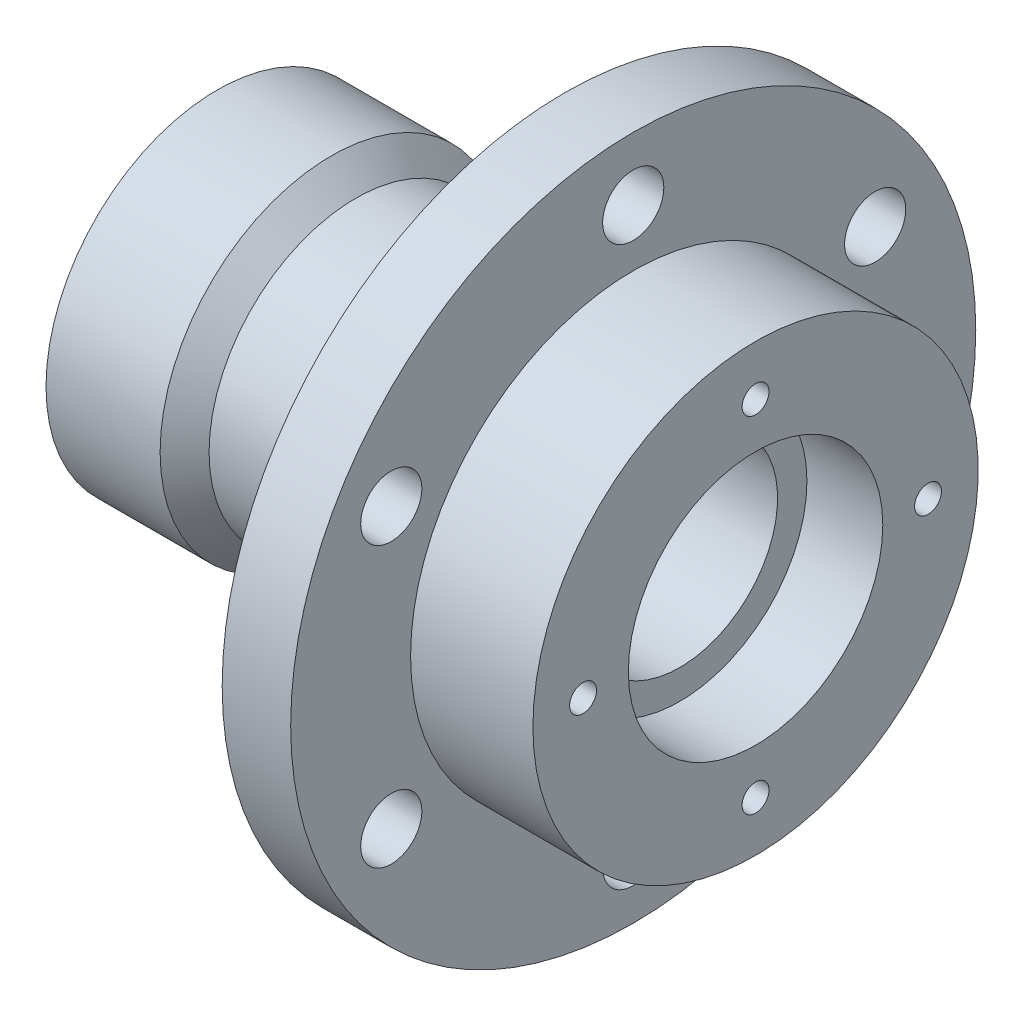
ISO-10303-21;
HEADER;
FILE_DESCRIPTION(('STEP AP214'),'2;1');
FILE_NAME('part.step','',(''),(''),'','','');
FILE_SCHEMA(('AUTOMOTIVE_DESIGN { 1 0 10303 214 1 1 1 1 }'));
ENDSEC;
DATA;
#1=APPLICATION_CONTEXT('core data for automotive mechanical design processes');
#2=APPLICATION_PROTOCOL_DEFINITION('international standard','automotive_design',2000,#1);
#3=PRODUCT_CONTEXT('',#1,'mechanical');
#4=PRODUCT('Part','Part','',(#3));
#5=PRODUCT_RELATED_PRODUCT_CATEGORY('part','',(#4));
#6=PRODUCT_DEFINITION_FORMATION('','',#4);
#7=PRODUCT_DEFINITION_CONTEXT('part definition',#1,'design');
#8=PRODUCT_DEFINITION('design','',#6,#7);
#9=PRODUCT_DEFINITION_SHAPE('','',#8);
#10=(LENGTH_UNIT() NAMED_UNIT(*) SI_UNIT(.MILLI.,.METRE.));
#11=(NAMED_UNIT(*) PLANE_ANGLE_UNIT() SI_UNIT($,.RADIAN.));
#12=(NAMED_UNIT(*) SI_UNIT($,.STERADIAN.) SOLID_ANGLE_UNIT());
#13=UNCERTAINTY_MEASURE_WITH_UNIT(LENGTH_MEASURE(1.E-05),#10,'distance_accuracy_value','');
#14=(GEOMETRIC_REPRESENTATION_CONTEXT(3) GLOBAL_UNCERTAINTY_ASSIGNED_CONTEXT((#13)) GLOBAL_UNIT_ASSIGNED_CONTEXT((#10,
#11,#12)) REPRESENTATION_CONTEXT('',''));
#15=CARTESIAN_POINT('',(0.,0.,0.));
#16=DIRECTION('',(0.,0.,1.));
#17=DIRECTION('',(1.,0.,0.));
#18=AXIS2_PLACEMENT_3D('',#15,#16,#17);
#19=CARTESIAN_POINT('',(85.,0.,0.));
#20=DIRECTION('',(1.,0.,0.));
#21=DIRECTION('',(0.,0.,-1.));
#22=AXIS2_PLACEMENT_3D('',#19,#20,#21);
#23=PLANE('',#22);
#24=CARTESIAN_POINT('',(85.,28.5450000000006,49.4413903020533));
#25=DIRECTION('',(1.,0.,0.));
#26=DIRECTION('',(0.,0.,-1.));
#27=AXIS2_PLACEMENT_3D('',#24,#25,#26);
#28=CIRCLE('',#27,6.24999999999999);
#29=CARTESIAN_POINT('',(85.,28.5450000000006,43.1913903020533));
#30=VERTEX_POINT('',#29);
#31=EDGE_CURVE('E95',#30,#30,#28,.F.);
#32=ORIENTED_EDGE('',*,*,#31,.T.);
#33=EDGE_LOOP('',(#32));
#34=FACE_BOUND('',#33,.T.);
#35=CARTESIAN_POINT('',(85.,-28.5449999999995,49.4413903020539));
#36=DIRECTION('',(1.,0.,0.));
#37=DIRECTION('',(0.,0.,-1.));
#38=AXIS2_PLACEMENT_3D('',#35,#36,#37);
#39=CIRCLE('',#38,6.24999999999999);
#40=CARTESIAN_POINT('',(85.,-28.5449999999995,43.1913903020539));
#41=VERTEX_POINT('',#40);
#42=EDGE_CURVE('E101',#41,#41,#39,.F.);
#43=ORIENTED_EDGE('',*,*,#42,.T.);
#44=EDGE_LOOP('',(#43));
#45=FACE_BOUND('',#44,.T.);
#46=CARTESIAN_POINT('',(85.,-28.5450000000002,-49.4413903020535));
#47=DIRECTION('',(1.,0.,0.));
#48=DIRECTION('',(0.,0.,-1.));
#49=AXIS2_PLACEMENT_3D('',#46,#47,#48);
#50=CIRCLE('',#49,6.24999999999999);
#51=CARTESIAN_POINT('',(85.,-28.5450000000002,-55.6913903020535));
#52=VERTEX_POINT('',#51);
#53=EDGE_CURVE('E113',#52,#52,#50,.F.);
#54=ORIENTED_EDGE('',*,*,#53,.T.);
#55=EDGE_LOOP('',(#54));
#56=FACE_BOUND('',#55,.T.);
#57=CARTESIAN_POINT('',(85.,28.5449999999999,-49.4413903020537));
#58=DIRECTION('',(1.,0.,0.));
#59=DIRECTION('',(0.,0.,-1.));
#60=AXIS2_PLACEMENT_3D('',#57,#58,#59);
#61=CIRCLE('',#60,6.24999999999999);
#62=CARTESIAN_POINT('',(85.,28.5449999999999,-55.6913903020537));
#63=VERTEX_POINT('',#62);
#64=EDGE_CURVE('E119',#63,#63,#61,.F.);
#65=ORIENTED_EDGE('',*,*,#64,.T.);
#66=EDGE_LOOP('',(#65));
#67=FACE_BOUND('',#66,.T.);
#68=CARTESIAN_POINT('',(85.,0.,0.));
#69=DIRECTION('',(-1.,0.,0.));
#70=DIRECTION('',(0.,0.,1.));
#71=AXIS2_PLACEMENT_3D('',#68,#69,#70);
#72=CIRCLE('',#71,70.);
#73=CARTESIAN_POINT('',(85.,0.,70.));
#74=VERTEX_POINT('',#73);
#75=EDGE_CURVE('E167',#74,#74,#72,.T.);
#76=ORIENTED_EDGE('',*,*,#75,.F.);
#77=EDGE_LOOP('',(#76));
#78=FACE_BOUND('',#77,.T.);
#79=CARTESIAN_POINT('',(85.,0.,0.));
#80=DIRECTION('',(-1.,0.,0.));
#81=DIRECTION('',(0.,0.,1.));
#82=AXIS2_PLACEMENT_3D('',#79,#80,#81);
#83=CIRCLE('',#82,45.5);
#84=CARTESIAN_POINT('',(85.,0.,45.5));
#85=VERTEX_POINT('',#84);
#86=EDGE_CURVE('E170',#85,#85,#83,.T.);
#87=ORIENTED_EDGE('',*,*,#86,.T.);
#88=EDGE_LOOP('',(#87));
#89=FACE_BOUND('',#88,.T.);
#90=CARTESIAN_POINT('',(85.,57.09,0.));
#91=DIRECTION('',(1.,0.,0.));
#92=DIRECTION('',(0.,0.,-1.));
#93=AXIS2_PLACEMENT_3D('',#90,#91,#92);
#94=CIRCLE('',#93,6.24999999999999);
#95=CARTESIAN_POINT('',(85.,57.09,-6.24999999999999));
#96=VERTEX_POINT('',#95);
#97=EDGE_CURVE('E125',#96,#96,#94,.F.);
#98=ORIENTED_EDGE('',*,*,#97,.T.);
#99=EDGE_LOOP('',(#98));
#100=FACE_BOUND('',#99,.T.);
#101=CARTESIAN_POINT('',(85.,-57.09,0.));
#102=DIRECTION('',(1.,0.,0.));
#103=DIRECTION('',(0.,0.,-1.));
#104=AXIS2_PLACEMENT_3D('',#101,#102,#103);
#105=CIRCLE('',#104,6.25);
#106=CARTESIAN_POINT('',(85.,-57.09,-6.25));
#107=VERTEX_POINT('',#106);
#108=EDGE_CURVE('E107',#107,#107,#105,.F.);
#109=ORIENTED_EDGE('',*,*,#108,.T.);
#110=EDGE_LOOP('',(#109));
#111=FACE_BOUND('',#110,.T.);
#112=ADVANCED_FACE('F38',(#34,#45,#56,#67,#78,#89,#100,#111),#23,.T.);
#113=CARTESIAN_POINT('',(94.5,0.,0.));
#114=DIRECTION('',(-1.,0.,0.));
#115=DIRECTION('',(0.,0.,1.));
#116=AXIS2_PLACEMENT_3D('',#113,#114,#115);
#117=PLANE('',#116);
#118=CARTESIAN_POINT('',(94.5,0.,0.));
#119=DIRECTION('',(-1.,0.,0.));
#120=DIRECTION('',(0.,0.,1.));
#121=AXIS2_PLACEMENT_3D('',#118,#119,#120);
#122=CIRCLE('',#121,26.);
#123=CARTESIAN_POINT('',(94.5,0.,26.));
#124=VERTEX_POINT('',#123);
#125=EDGE_CURVE('E11',#124,#124,#122,.T.);
#126=ORIENTED_EDGE('',*,*,#125,.F.);
#127=EDGE_LOOP('',(#126));
#128=FACE_BOUND('',#127,.T.);
#129=CARTESIAN_POINT('',(94.5,0.,0.));
#130=DIRECTION('',(-1.,0.,0.));
#131=DIRECTION('',(0.,0.,1.));
#132=AXIS2_PLACEMENT_3D('',#129,#130,#131);
#133=CIRCLE('',#132,20.);
#134=CARTESIAN_POINT('',(94.5,0.,20.));
#135=VERTEX_POINT('',#134);
#136=EDGE_CURVE('E128',#135,#135,#133,.T.);
#137=ORIENTED_EDGE('',*,*,#136,.T.);
#138=EDGE_LOOP('',(#137));
#139=FACE_BOUND('',#138,.T.);
#140=ADVANCED_FACE('F40',(#128,#139),#117,.F.);
#141=CARTESIAN_POINT('',(-28.7480653287739,0.,0.));
#142=DIRECTION('',(-1.,0.,0.));
#143=DIRECTION('',(0.,0.,1.));
#144=AXIS2_PLACEMENT_3D('',#141,#142,#143);
#145=CYLINDRICAL_SURFACE('',#144,26.);
#146=CARTESIAN_POINT('',(110.,0.,0.));
#147=DIRECTION('',(-1.,0.,0.));
#148=DIRECTION('',(0.,0.,1.));
#149=AXIS2_PLACEMENT_3D('',#146,#147,#148);
#150=CIRCLE('',#149,26.);
#151=CARTESIAN_POINT('',(110.,0.,26.));
#152=VERTEX_POINT('',#151);
#153=EDGE_CURVE('E46',#152,#152,#150,.T.);
#154=ORIENTED_EDGE('',*,*,#153,.F.);
#155=EDGE_LOOP('',(#154));
#156=FACE_BOUND('',#155,.T.);
#157=ORIENTED_EDGE('',*,*,#125,.T.);
#158=EDGE_LOOP('',(#157));
#159=FACE_BOUND('',#158,.T.);
#160=ADVANCED_FACE('F181',(#156,#159),#145,.F.);
#161=CARTESIAN_POINT('',(110.,0.,0.));
#162=DIRECTION('',(1.,0.,0.));
#163=DIRECTION('',(0.,0.,-1.));
#164=AXIS2_PLACEMENT_3D('',#161,#162,#163);
#165=PLANE('',#164);
#166=CARTESIAN_POINT('',(110.,3.69224151582661E-13,35.25));
#167=DIRECTION('',(1.,0.,0.));
#168=DIRECTION('',(0.,0.,-1.));
#169=AXIS2_PLACEMENT_3D('',#166,#167,#168);
#170=CIRCLE('',#169,2.75);
#171=CARTESIAN_POINT('',(110.,3.69224151582661E-13,32.5));
#172=VERTEX_POINT('',#171);
#173=EDGE_CURVE('E70',#172,#172,#170,.T.);
#174=ORIENTED_EDGE('',*,*,#173,.F.);
#175=EDGE_LOOP('',(#174));
#176=FACE_BOUND('',#175,.T.);
#177=CARTESIAN_POINT('',(110.,-35.25,0.));
#178=DIRECTION('',(1.,0.,0.));
#179=DIRECTION('',(0.,0.,-1.));
#180=AXIS2_PLACEMENT_3D('',#177,#178,#179);
#181=CIRCLE('',#180,2.75);
#182=CARTESIAN_POINT('',(110.,-35.25,-2.75));
#183=VERTEX_POINT('',#182);
#184=EDGE_CURVE('E69',#183,#183,#181,.T.);
#185=ORIENTED_EDGE('',*,*,#184,.F.);
#186=EDGE_LOOP('',(#185));
#187=FACE_BOUND('',#186,.T.);
#188=CARTESIAN_POINT('',(110.,-1.2307471719422E-13,-35.25));
#189=DIRECTION('',(1.,0.,0.));
#190=DIRECTION('',(0.,0.,-1.));
#191=AXIS2_PLACEMENT_3D('',#188,#189,#190);
#192=CIRCLE('',#191,2.75);
#193=CARTESIAN_POINT('',(110.,-1.2307471719422E-13,-38.));
#194=VERTEX_POINT('',#193);
#195=EDGE_CURVE('E80',#194,#194,#192,.T.);
#196=ORIENTED_EDGE('',*,*,#195,.F.);
#197=EDGE_LOOP('',(#196));
#198=FACE_BOUND('',#197,.T.);
#199=CARTESIAN_POINT('',(110.,35.25,0.));
#200=DIRECTION('',(1.,0.,0.));
#201=DIRECTION('',(0.,0.,-1.));
#202=AXIS2_PLACEMENT_3D('',#199,#200,#201);
#203=CIRCLE('',#202,2.75);
#204=CARTESIAN_POINT('',(110.,35.25,-2.75));
#205=VERTEX_POINT('',#204);
#206=EDGE_CURVE('E86',#205,#205,#203,.T.);
#207=ORIENTED_EDGE('',*,*,#206,.F.);
#208=EDGE_LOOP('',(#207));
#209=FACE_BOUND('',#208,.T.);
#210=ORIENTED_EDGE('',*,*,#153,.T.);
#211=EDGE_LOOP('',(#210));
#212=FACE_BOUND('',#211,.T.);
#213=CARTESIAN_POINT('',(110.,0.,0.));
#214=DIRECTION('',(-1.,0.,0.));
#215=DIRECTION('',(0.,0.,1.));
#216=AXIS2_PLACEMENT_3D('',#213,#214,#215);
#217=CIRCLE('',#216,45.5);
#218=CARTESIAN_POINT('',(110.,0.,45.5));
#219=VERTEX_POINT('',#218);
#220=EDGE_CURVE('E173',#219,#219,#217,.T.);
#221=ORIENTED_EDGE('',*,*,#220,.F.);
#222=EDGE_LOOP('',(#221));
#223=FACE_BOUND('',#222,.T.);
#224=ADVANCED_FACE('F178',(#176,#187,#198,#209,#212,#223),#165,.T.);
#225=CARTESIAN_POINT('',(-28.7480653287739,0.,0.));
#226=DIRECTION('',(-1.,0.,0.));
#227=DIRECTION('',(0.,0.,1.));
#228=AXIS2_PLACEMENT_3D('',#225,#226,#227);
#229=CYLINDRICAL_SURFACE('',#228,45.5);
#230=ORIENTED_EDGE('',*,*,#220,.T.);
#231=EDGE_LOOP('',(#230));
#232=FACE_BOUND('',#231,.T.);
#233=ORIENTED_EDGE('',*,*,#86,.F.);
#234=EDGE_LOOP('',(#233));
#235=FACE_BOUND('',#234,.T.);
#236=ADVANCED_FACE('F254',(#232,#235),#229,.T.);
#237=CARTESIAN_POINT('',(-28.7480653287739,0.,0.));
#238=DIRECTION('',(-1.,0.,0.));
#239=DIRECTION('',(0.,0.,1.));
#240=AXIS2_PLACEMENT_3D('',#237,#238,#239);
#241=CYLINDRICAL_SURFACE('',#240,70.);
#242=ORIENTED_EDGE('',*,*,#75,.T.);
#243=EDGE_LOOP('',(#242));
#244=FACE_BOUND('',#243,.T.);
#245=CARTESIAN_POINT('',(71.,0.,0.));
#246=DIRECTION('',(-1.,0.,0.));
#247=DIRECTION('',(0.,0.,1.));
#248=AXIS2_PLACEMENT_3D('',#245,#246,#247);
#249=CIRCLE('',#248,70.);
#250=CARTESIAN_POINT('',(71.,0.,70.));
#251=VERTEX_POINT('',#250);
#252=EDGE_CURVE('E164',#251,#251,#249,.T.);
#253=ORIENTED_EDGE('',*,*,#252,.F.);
#254=EDGE_LOOP('',(#253));
#255=FACE_BOUND('',#254,.T.);
#256=ADVANCED_FACE('F252',(#244,#255),#241,.T.);
#257=CARTESIAN_POINT('',(71.,0.,0.));
#258=DIRECTION('',(-1.,0.,0.));
#259=DIRECTION('',(0.,0.,1.));
#260=AXIS2_PLACEMENT_3D('',#257,#258,#259);
#261=PLANE('',#260);
#262=CARTESIAN_POINT('',(71.,28.5450000000006,49.4413903020533));
#263=DIRECTION('',(-1.,0.,0.));
#264=DIRECTION('',(0.,0.,1.));
#265=AXIS2_PLACEMENT_3D('',#262,#263,#264);
#266=CIRCLE('',#265,6.24999999999998);
#267=CARTESIAN_POINT('',(71.,28.5450000000006,55.6913903020533));
#268=VERTEX_POINT('',#267);
#269=EDGE_CURVE('E92',#268,#268,#266,.T.);
#270=ORIENTED_EDGE('',*,*,#269,.F.);
#271=EDGE_LOOP('',(#270));
#272=FACE_BOUND('',#271,.T.);
#273=CARTESIAN_POINT('',(71.,-28.5449999999995,49.4413903020539));
#274=DIRECTION('',(-1.,0.,0.));
#275=DIRECTION('',(0.,0.,1.));
#276=AXIS2_PLACEMENT_3D('',#273,#274,#275);
#277=CIRCLE('',#276,6.24999999999999);
#278=CARTESIAN_POINT('',(71.,-28.5449999999995,55.6913903020539));
#279=VERTEX_POINT('',#278);
#280=EDGE_CURVE('E98',#279,#279,#277,.T.);
#281=ORIENTED_EDGE('',*,*,#280,.F.);
#282=EDGE_LOOP('',(#281));
#283=FACE_BOUND('',#282,.T.);
#284=CARTESIAN_POINT('',(71.,-57.09,0.));
#285=DIRECTION('',(-1.,0.,0.));
#286=DIRECTION('',(0.,0.,1.));
#287=AXIS2_PLACEMENT_3D('',#284,#285,#286);
#288=CIRCLE('',#287,6.24999999999999);
#289=CARTESIAN_POINT('',(71.,-57.09,6.24999999999999));
#290=VERTEX_POINT('',#289);
#291=EDGE_CURVE('E104',#290,#290,#288,.T.);
#292=ORIENTED_EDGE('',*,*,#291,.F.);
#293=EDGE_LOOP('',(#292));
#294=FACE_BOUND('',#293,.T.);
#295=CARTESIAN_POINT('',(71.,-28.5450000000002,-49.4413903020535));
#296=DIRECTION('',(-1.,0.,0.));
#297=DIRECTION('',(0.,0.,1.));
#298=AXIS2_PLACEMENT_3D('',#295,#296,#297);
#299=CIRCLE('',#298,6.24999999999999);
#300=CARTESIAN_POINT('',(71.,-28.5450000000002,-43.1913903020535));
#301=VERTEX_POINT('',#300);
#302=EDGE_CURVE('E110',#301,#301,#299,.T.);
#303=ORIENTED_EDGE('',*,*,#302,.F.);
#304=EDGE_LOOP('',(#303));
#305=FACE_BOUND('',#304,.T.);
#306=CARTESIAN_POINT('',(71.,28.5449999999999,-49.4413903020537));
#307=DIRECTION('',(-1.,0.,0.));
#308=DIRECTION('',(0.,0.,1.));
#309=AXIS2_PLACEMENT_3D('',#306,#307,#308);
#310=CIRCLE('',#309,6.24999999999999);
#311=CARTESIAN_POINT('',(71.,28.5449999999999,-43.1913903020537));
#312=VERTEX_POINT('',#311);
#313=EDGE_CURVE('E116',#312,#312,#310,.T.);
#314=ORIENTED_EDGE('',*,*,#313,.F.);
#315=EDGE_LOOP('',(#314));
#316=FACE_BOUND('',#315,.T.);
#317=CARTESIAN_POINT('',(71.,57.09,0.));
#318=DIRECTION('',(-1.,0.,0.));
#319=DIRECTION('',(0.,0.,1.));
#320=AXIS2_PLACEMENT_3D('',#317,#318,#319);
#321=CIRCLE('',#320,6.24999999999999);
#322=CARTESIAN_POINT('',(71.,57.09,6.24999999999999));
#323=VERTEX_POINT('',#322);
#324=EDGE_CURVE('E122',#323,#323,#321,.T.);
#325=ORIENTED_EDGE('',*,*,#324,.F.);
#326=EDGE_LOOP('',(#325));
#327=FACE_BOUND('',#326,.T.);
#328=ORIENTED_EDGE('',*,*,#252,.T.);
#329=EDGE_LOOP('',(#328));
#330=FACE_BOUND('',#329,.T.);
#331=CARTESIAN_POINT('',(71.,0.,0.));
#332=DIRECTION('',(-1.,0.,0.));
#333=DIRECTION('',(0.,0.,1.));
#334=AXIS2_PLACEMENT_3D('',#331,#332,#333);
#335=CIRCLE('',#334,30.);
#336=CARTESIAN_POINT('',(71.,0.,30.));
#337=VERTEX_POINT('',#336);
#338=EDGE_CURVE('E161',#337,#337,#335,.T.);
#339=ORIENTED_EDGE('',*,*,#338,.F.);
#340=EDGE_LOOP('',(#339));
#341=FACE_BOUND('',#340,.T.);
#342=ADVANCED_FACE('F314',(#272,#283,#294,#305,#316,#327,#330,#341),#261,.T.);
#343=CARTESIAN_POINT('',(-28.7480653287739,0.,0.));
#344=DIRECTION('',(-1.,0.,0.));
#345=DIRECTION('',(0.,0.,1.));
#346=AXIS2_PLACEMENT_3D('',#343,#344,#345);
#347=CYLINDRICAL_SURFACE('',#346,30.);
#348=ORIENTED_EDGE('',*,*,#338,.T.);
#349=EDGE_LOOP('',(#348));
#350=FACE_BOUND('',#349,.T.);
#351=CARTESIAN_POINT('',(28.3178894074866,0.,0.));
#352=DIRECTION('',(-1.,0.,0.));
#353=DIRECTION('',(0.,0.,1.));
#354=AXIS2_PLACEMENT_3D('',#351,#352,#353);
#355=CIRCLE('',#354,30.);
#356=CARTESIAN_POINT('',(28.3178894074866,0.,30.));
#357=VERTEX_POINT('',#356);
#358=EDGE_CURVE('E158',#357,#357,#355,.T.);
#359=ORIENTED_EDGE('',*,*,#358,.F.);
#360=EDGE_LOOP('',(#359));
#361=FACE_BOUND('',#360,.T.);
#362=ADVANCED_FACE('F317',(#350,#361),#347,.T.);
#363=CARTESIAN_POINT('',(23.3178894074866,0.,0.));
#364=DIRECTION('',(-1.,0.,0.));
#365=DIRECTION('',(0.,0.,1.));
#366=AXIS2_PLACEMENT_3D('',#363,#364,#365);
#367=CONICAL_SURFACE('',#366,35.,0.78539816339745);
#368=ORIENTED_EDGE('',*,*,#358,.T.);
#369=EDGE_LOOP('',(#368));
#370=FACE_BOUND('',#369,.T.);
#371=CARTESIAN_POINT('',(23.3178894074866,0.,0.));
#372=DIRECTION('',(-1.,0.,0.));
#373=DIRECTION('',(0.,0.,1.));
#374=AXIS2_PLACEMENT_3D('',#371,#372,#373);
#375=CIRCLE('',#374,35.);
#376=CARTESIAN_POINT('',(23.3178894074866,0.,35.));
#377=VERTEX_POINT('',#376);
#378=EDGE_CURVE('E155',#377,#377,#375,.T.);
#379=ORIENTED_EDGE('',*,*,#378,.F.);
#380=EDGE_LOOP('',(#379));
#381=FACE_BOUND('',#380,.T.);
#382=ADVANCED_FACE('F241',(#370,#381),#367,.T.);
#383=CARTESIAN_POINT('',(-28.7480653287739,0.,0.));
#384=DIRECTION('',(-1.,0.,0.));
#385=DIRECTION('',(0.,0.,1.));
#386=AXIS2_PLACEMENT_3D('',#383,#384,#385);
#387=CYLINDRICAL_SURFACE('',#386,35.);
#388=ORIENTED_EDGE('',*,*,#378,.T.);
#389=EDGE_LOOP('',(#388));
#390=FACE_BOUND('',#389,.T.);
#391=CARTESIAN_POINT('',(0.,0.,0.));
#392=DIRECTION('',(-1.,0.,0.));
#393=DIRECTION('',(0.,0.,1.));
#394=AXIS2_PLACEMENT_3D('',#391,#392,#393);
#395=CIRCLE('',#394,35.);
#396=CARTESIAN_POINT('',(0.,0.,35.));
#397=VERTEX_POINT('',#396);
#398=EDGE_CURVE('E152',#397,#397,#395,.T.);
#399=ORIENTED_EDGE('',*,*,#398,.F.);
#400=EDGE_LOOP('',(#399));
#401=FACE_BOUND('',#400,.T.);
#402=ADVANCED_FACE('F235',(#390,#401),#387,.T.);
#403=CARTESIAN_POINT('',(0.,0.,0.));
#404=DIRECTION('',(-1.,0.,0.));
#405=DIRECTION('',(0.,0.,1.));
#406=AXIS2_PLACEMENT_3D('',#403,#404,#405);
#407=PLANE('',#406);
#408=ORIENTED_EDGE('',*,*,#398,.T.);
#409=EDGE_LOOP('',(#408));
#410=FACE_BOUND('',#409,.T.);
#411=CARTESIAN_POINT('',(0.,0.,0.));
#412=DIRECTION('',(-1.,0.,0.));
#413=DIRECTION('',(0.,0.,1.));
#414=AXIS2_PLACEMENT_3D('',#411,#412,#413);
#415=CIRCLE('',#414,23.5);
#416=CARTESIAN_POINT('',(0.,0.,23.5));
#417=VERTEX_POINT('',#416);
#418=EDGE_CURVE('E149',#417,#417,#415,.T.);
#419=ORIENTED_EDGE('',*,*,#418,.F.);
#420=EDGE_LOOP('',(#419));
#421=FACE_BOUND('',#420,.T.);
#422=ADVANCED_FACE('F230',(#410,#421),#407,.T.);
#423=CARTESIAN_POINT('',(-28.7480653287739,0.,0.));
#424=DIRECTION('',(-1.,0.,0.));
#425=DIRECTION('',(0.,0.,1.));
#426=AXIS2_PLACEMENT_3D('',#423,#424,#425);
#427=CYLINDRICAL_SURFACE('',#426,23.5);
#428=CARTESIAN_POINT('',(2.,0.,0.));
#429=DIRECTION('',(-1.,0.,0.));
#430=DIRECTION('',(0.,0.,1.));
#431=AXIS2_PLACEMENT_3D('',#428,#429,#430);
#432=CIRCLE('',#431,23.5);
#433=CARTESIAN_POINT('',(2.,0.,23.5));
#434=VERTEX_POINT('',#433);
#435=EDGE_CURVE('E146',#434,#434,#432,.T.);
#436=ORIENTED_EDGE('',*,*,#435,.F.);
#437=EDGE_LOOP('',(#436));
#438=FACE_BOUND('',#437,.T.);
#439=ORIENTED_EDGE('',*,*,#418,.T.);
#440=EDGE_LOOP('',(#439));
#441=FACE_BOUND('',#440,.T.);
#442=ADVANCED_FACE('F224',(#438,#441),#427,.F.);
#443=CARTESIAN_POINT('',(2.,0.,0.));
#444=DIRECTION('',(-1.,0.,0.));
#445=DIRECTION('',(0.,0.,1.));
#446=AXIS2_PLACEMENT_3D('',#443,#444,#445);
#447=PLANE('',#446);
#448=CARTESIAN_POINT('',(2.,0.,0.));
#449=DIRECTION('',(-1.,0.,0.));
#450=DIRECTION('',(0.,0.,1.));
#451=AXIS2_PLACEMENT_3D('',#448,#449,#450);
#452=CIRCLE('',#451,24.75);
#453=CARTESIAN_POINT('',(2.,0.,24.75));
#454=VERTEX_POINT('',#453);
#455=EDGE_CURVE('E143',#454,#454,#452,.T.);
#456=ORIENTED_EDGE('',*,*,#455,.F.);
#457=EDGE_LOOP('',(#456));
#458=FACE_BOUND('',#457,.T.);
#459=ORIENTED_EDGE('',*,*,#435,.T.);
#460=EDGE_LOOP('',(#459));
#461=FACE_BOUND('',#460,.T.);
#462=ADVANCED_FACE('F218',(#458,#461),#447,.F.);
#463=CARTESIAN_POINT('',(-28.7480653287739,0.,0.));
#464=DIRECTION('',(-1.,0.,0.));
#465=DIRECTION('',(0.,0.,1.));
#466=AXIS2_PLACEMENT_3D('',#463,#464,#465);
#467=CYLINDRICAL_SURFACE('',#466,24.75);
#468=CARTESIAN_POINT('',(3.85,0.,0.));
#469=DIRECTION('',(-1.,0.,0.));
#470=DIRECTION('',(0.,0.,1.));
#471=AXIS2_PLACEMENT_3D('',#468,#469,#470);
#472=CIRCLE('',#471,24.75);
#473=CARTESIAN_POINT('',(3.85,0.,24.75));
#474=VERTEX_POINT('',#473);
#475=EDGE_CURVE('E140',#474,#474,#472,.T.);
#476=ORIENTED_EDGE('',*,*,#475,.F.);
#477=EDGE_LOOP('',(#476));
#478=FACE_BOUND('',#477,.T.);
#479=ORIENTED_EDGE('',*,*,#455,.T.);
#480=EDGE_LOOP('',(#479));
#481=FACE_BOUND('',#480,.T.);
#482=ADVANCED_FACE('F212',(#478,#481),#467,.F.);
#483=CARTESIAN_POINT('',(3.85,0.,0.));
#484=DIRECTION('',(1.,0.,0.));
#485=DIRECTION('',(0.,0.,-1.));
#486=AXIS2_PLACEMENT_3D('',#483,#484,#485);
#487=PLANE('',#486);
#488=CARTESIAN_POINT('',(3.85,0.,0.));
#489=DIRECTION('',(-1.,0.,0.));
#490=DIRECTION('',(0.,0.,1.));
#491=AXIS2_PLACEMENT_3D('',#488,#489,#490);
#492=CIRCLE('',#491,23.5);
#493=CARTESIAN_POINT('',(3.85,0.,23.5));
#494=VERTEX_POINT('',#493);
#495=EDGE_CURVE('E137',#494,#494,#492,.T.);
#496=ORIENTED_EDGE('',*,*,#495,.F.);
#497=EDGE_LOOP('',(#496));
#498=FACE_BOUND('',#497,.T.);
#499=ORIENTED_EDGE('',*,*,#475,.T.);
#500=EDGE_LOOP('',(#499));
#501=FACE_BOUND('',#500,.T.);
#502=ADVANCED_FACE('F206',(#498,#501),#487,.F.);
#503=CARTESIAN_POINT('',(-28.7480653287739,0.,0.));
#504=DIRECTION('',(-1.,0.,0.));
#505=DIRECTION('',(0.,0.,1.));
#506=AXIS2_PLACEMENT_3D('',#503,#504,#505);
#507=CYLINDRICAL_SURFACE('',#506,23.5);
#508=CARTESIAN_POINT('',(17.85,0.,0.));
#509=DIRECTION('',(-1.,0.,0.));
#510=DIRECTION('',(0.,0.,1.));
#511=AXIS2_PLACEMENT_3D('',#508,#509,#510);
#512=CIRCLE('',#511,23.5);
#513=CARTESIAN_POINT('',(17.85,0.,23.5));
#514=VERTEX_POINT('',#513);
#515=EDGE_CURVE('E134',#514,#514,#512,.T.);
#516=ORIENTED_EDGE('',*,*,#515,.F.);
#517=EDGE_LOOP('',(#516));
#518=FACE_BOUND('',#517,.T.);
#519=ORIENTED_EDGE('',*,*,#495,.T.);
#520=EDGE_LOOP('',(#519));
#521=FACE_BOUND('',#520,.T.);
#522=ADVANCED_FACE('F200',(#518,#521),#507,.F.);
#523=CARTESIAN_POINT('',(17.85,0.,0.));
#524=DIRECTION('',(1.,0.,0.));
#525=DIRECTION('',(0.,0.,-1.));
#526=AXIS2_PLACEMENT_3D('',#523,#524,#525);
#527=PLANE('',#526);
#528=CARTESIAN_POINT('',(17.85,0.,0.));
#529=DIRECTION('',(-1.,0.,0.));
#530=DIRECTION('',(0.,0.,1.));
#531=AXIS2_PLACEMENT_3D('',#528,#529,#530);
#532=CIRCLE('',#531,20.);
#533=CARTESIAN_POINT('',(17.85,0.,20.));
#534=VERTEX_POINT('',#533);
#535=EDGE_CURVE('E131',#534,#534,#532,.T.);
#536=ORIENTED_EDGE('',*,*,#535,.F.);
#537=EDGE_LOOP('',(#536));
#538=FACE_BOUND('',#537,.T.);
#539=ORIENTED_EDGE('',*,*,#515,.T.);
#540=EDGE_LOOP('',(#539));
#541=FACE_BOUND('',#540,.T.);
#542=ADVANCED_FACE('F194',(#538,#541),#527,.F.);
#543=CARTESIAN_POINT('',(-28.7480653287739,0.,0.));
#544=DIRECTION('',(-1.,0.,0.));
#545=DIRECTION('',(0.,0.,1.));
#546=AXIS2_PLACEMENT_3D('',#543,#544,#545);
#547=CYLINDRICAL_SURFACE('',#546,20.);
#548=ORIENTED_EDGE('',*,*,#136,.F.);
#549=EDGE_LOOP('',(#548));
#550=FACE_BOUND('',#549,.T.);
#551=ORIENTED_EDGE('',*,*,#535,.T.);
#552=EDGE_LOOP('',(#551));
#553=FACE_BOUND('',#552,.T.);
#554=ADVANCED_FACE('F190',(#550,#553),#547,.F.);
#555=CARTESIAN_POINT('',(71.,57.09,0.));
#556=DIRECTION('',(-1.,0.,0.));
#557=DIRECTION('',(0.,0.,1.));
#558=AXIS2_PLACEMENT_3D('',#555,#556,#557);
#559=CYLINDRICAL_SURFACE('',#558,6.24999999999999);
#560=ORIENTED_EDGE('',*,*,#97,.F.);
#561=EDGE_LOOP('',(#560));
#562=FACE_BOUND('',#561,.T.);
#563=ORIENTED_EDGE('',*,*,#324,.T.);
#564=EDGE_LOOP('',(#563));
#565=FACE_BOUND('',#564,.T.);
#566=ADVANCED_FACE('F193',(#562,#565),#559,.F.);
#567=CARTESIAN_POINT('',(71.,28.5449999999999,-49.4413903020537));
#568=DIRECTION('',(-1.,0.,0.));
#569=DIRECTION('',(0.,0.,1.));
#570=AXIS2_PLACEMENT_3D('',#567,#568,#569);
#571=CYLINDRICAL_SURFACE('',#570,6.24999999999999);
#572=ORIENTED_EDGE('',*,*,#64,.F.);
#573=EDGE_LOOP('',(#572));
#574=FACE_BOUND('',#573,.T.);
#575=ORIENTED_EDGE('',*,*,#313,.T.);
#576=EDGE_LOOP('',(#575));
#577=FACE_BOUND('',#576,.T.);
#578=ADVANCED_FACE('F301',(#574,#577),#571,.F.);
#579=CARTESIAN_POINT('',(71.,-28.5450000000002,-49.4413903020535));
#580=DIRECTION('',(-1.,0.,0.));
#581=DIRECTION('',(0.,0.,1.));
#582=AXIS2_PLACEMENT_3D('',#579,#580,#581);
#583=CYLINDRICAL_SURFACE('',#582,6.24999999999999);
#584=ORIENTED_EDGE('',*,*,#53,.F.);
#585=EDGE_LOOP('',(#584));
#586=FACE_BOUND('',#585,.T.);
#587=ORIENTED_EDGE('',*,*,#302,.T.);
#588=EDGE_LOOP('',(#587));
#589=FACE_BOUND('',#588,.T.);
#590=ADVANCED_FACE('F297',(#586,#589),#583,.F.);
#591=CARTESIAN_POINT('',(71.,-57.09,0.));
#592=DIRECTION('',(-1.,0.,0.));
#593=DIRECTION('',(0.,0.,1.));
#594=AXIS2_PLACEMENT_3D('',#591,#592,#593);
#595=CYLINDRICAL_SURFACE('',#594,6.25);
#596=ORIENTED_EDGE('',*,*,#108,.F.);
#597=EDGE_LOOP('',(#596));
#598=FACE_BOUND('',#597,.T.);
#599=ORIENTED_EDGE('',*,*,#291,.T.);
#600=EDGE_LOOP('',(#599));
#601=FACE_BOUND('',#600,.T.);
#602=ADVANCED_FACE('F293',(#598,#601),#595,.F.);
#603=CARTESIAN_POINT('',(71.,-28.5449999999995,49.4413903020539));
#604=DIRECTION('',(-1.,0.,0.));
#605=DIRECTION('',(0.,0.,1.));
#606=AXIS2_PLACEMENT_3D('',#603,#604,#605);
#607=CYLINDRICAL_SURFACE('',#606,6.24999999999999);
#608=ORIENTED_EDGE('',*,*,#42,.F.);
#609=EDGE_LOOP('',(#608));
#610=FACE_BOUND('',#609,.T.);
#611=ORIENTED_EDGE('',*,*,#280,.T.);
#612=EDGE_LOOP('',(#611));
#613=FACE_BOUND('',#612,.T.);
#614=ADVANCED_FACE('F289',(#610,#613),#607,.F.);
#615=CARTESIAN_POINT('',(71.,28.5450000000006,49.4413903020533));
#616=DIRECTION('',(-1.,0.,0.));
#617=DIRECTION('',(0.,0.,1.));
#618=AXIS2_PLACEMENT_3D('',#615,#616,#617);
#619=CYLINDRICAL_SURFACE('',#618,6.24999999999999);
#620=ORIENTED_EDGE('',*,*,#31,.F.);
#621=EDGE_LOOP('',(#620));
#622=FACE_BOUND('',#621,.T.);
#623=ORIENTED_EDGE('',*,*,#269,.T.);
#624=EDGE_LOOP('',(#623));
#625=FACE_BOUND('',#624,.T.);
#626=ADVANCED_FACE('F282',(#622,#625),#619,.F.);
#627=CARTESIAN_POINT('',(98.,35.25,0.));
#628=DIRECTION('',(1.,0.,0.));
#629=DIRECTION('',(0.,0.,-1.));
#630=AXIS2_PLACEMENT_3D('',#627,#628,#629);
#631=CONICAL_SURFACE('',#630,2.75,1.02974425867665);
#632=CARTESIAN_POINT('',(96.3476332976742,35.25,0.));
#633=VERTEX_POINT('',#632);
#634=VERTEX_LOOP('',#633);
#635=FACE_BOUND('',#634,.T.);
#636=CARTESIAN_POINT('',(98.,35.25,0.));
#637=DIRECTION('',(1.,0.,0.));
#638=DIRECTION('',(0.,0.,-1.));
#639=AXIS2_PLACEMENT_3D('',#636,#637,#638);
#640=CIRCLE('',#639,2.75);
#641=CARTESIAN_POINT('',(98.,35.25,-2.75));
#642=VERTEX_POINT('',#641);
#643=EDGE_CURVE('E89',#642,#642,#640,.T.);
#644=ORIENTED_EDGE('',*,*,#643,.T.);
#645=EDGE_LOOP('',(#644));
#646=FACE_BOUND('',#645,.T.);
#647=ADVANCED_FACE('F273',(#635,#646),#631,.F.);
#648=CARTESIAN_POINT('',(110.,35.25,0.));
#649=DIRECTION('',(1.,0.,0.));
#650=DIRECTION('',(0.,0.,-1.));
#651=AXIS2_PLACEMENT_3D('',#648,#649,#650);
#652=CYLINDRICAL_SURFACE('',#651,2.75);
#653=ORIENTED_EDGE('',*,*,#643,.F.);
#654=EDGE_LOOP('',(#653));
#655=FACE_BOUND('',#654,.T.);
#656=ORIENTED_EDGE('',*,*,#206,.T.);
#657=EDGE_LOOP('',(#656));
#658=FACE_BOUND('',#657,.T.);
#659=ADVANCED_FACE('F270',(#655,#658),#652,.F.);
#660=CARTESIAN_POINT('',(98.,-1.2307471719422E-13,-35.25));
#661=DIRECTION('',(1.,0.,0.));
#662=DIRECTION('',(0.,0.,-1.));
#663=AXIS2_PLACEMENT_3D('',#660,#661,#662);
#664=CONICAL_SURFACE('',#663,2.75,1.02974425867665);
#665=CARTESIAN_POINT('',(96.3476332976742,-1.26418582630778E-13,-35.25));
#666=VERTEX_POINT('',#665);
#667=VERTEX_LOOP('',#666);
#668=FACE_BOUND('',#667,.T.);
#669=CARTESIAN_POINT('',(98.,-1.2307471719422E-13,-35.25));
#670=DIRECTION('',(1.,0.,0.));
#671=DIRECTION('',(0.,0.,-1.));
#672=AXIS2_PLACEMENT_3D('',#669,#670,#671);
#673=CIRCLE('',#672,2.75);
#674=CARTESIAN_POINT('',(98.,-1.2307471719422E-13,-38.));
#675=VERTEX_POINT('',#674);
#676=EDGE_CURVE('E83',#675,#675,#673,.T.);
#677=ORIENTED_EDGE('',*,*,#676,.T.);
#678=EDGE_LOOP('',(#677));
#679=FACE_BOUND('',#678,.T.);
#680=ADVANCED_FACE('F272',(#668,#679),#664,.F.);
#681=CARTESIAN_POINT('',(110.,-1.2307471719422E-13,-35.25));
#682=DIRECTION('',(1.,0.,0.));
#683=DIRECTION('',(0.,0.,-1.));
#684=AXIS2_PLACEMENT_3D('',#681,#682,#683);
#685=CYLINDRICAL_SURFACE('',#684,2.75);
#686=ORIENTED_EDGE('',*,*,#676,.F.);
#687=EDGE_LOOP('',(#686));
#688=FACE_BOUND('',#687,.T.);
#689=ORIENTED_EDGE('',*,*,#195,.T.);
#690=EDGE_LOOP('',(#689));
#691=FACE_BOUND('',#690,.T.);
#692=ADVANCED_FACE('F280',(#688,#691),#685,.F.);
#693=CARTESIAN_POINT('',(98.,-35.25,0.));
#694=DIRECTION('',(1.,0.,0.));
#695=DIRECTION('',(0.,0.,-1.));
#696=AXIS2_PLACEMENT_3D('',#693,#694,#695);
#697=CONICAL_SURFACE('',#696,2.75,1.02974425867665);
#698=CARTESIAN_POINT('',(96.3476332976742,-35.25,0.));
#699=VERTEX_POINT('',#698);
#700=VERTEX_LOOP('',#699);
#701=FACE_BOUND('',#700,.T.);
#702=CARTESIAN_POINT('',(98.,-35.25,0.));
#703=DIRECTION('',(1.,0.,0.));
#704=DIRECTION('',(0.,0.,-1.));
#705=AXIS2_PLACEMENT_3D('',#702,#703,#704);
#706=CIRCLE('',#705,2.75);
#707=CARTESIAN_POINT('',(98.,-35.25,-2.75));
#708=VERTEX_POINT('',#707);
#709=EDGE_CURVE('E73',#708,#708,#706,.T.);
#710=ORIENTED_EDGE('',*,*,#709,.T.);
#711=EDGE_LOOP('',(#710));
#712=FACE_BOUND('',#711,.T.);
#713=ADVANCED_FACE('F466',(#701,#712),#697,.F.);
#714=CARTESIAN_POINT('',(110.,-35.25,0.));
#715=DIRECTION('',(1.,0.,0.));
#716=DIRECTION('',(0.,0.,-1.));
#717=AXIS2_PLACEMENT_3D('',#714,#715,#716);
#718=CYLINDRICAL_SURFACE('',#717,2.75);
#719=ORIENTED_EDGE('',*,*,#709,.F.);
#720=EDGE_LOOP('',(#719));
#721=FACE_BOUND('',#720,.T.);
#722=ORIENTED_EDGE('',*,*,#184,.T.);
#723=EDGE_LOOP('',(#722));
#724=FACE_BOUND('',#723,.T.);
#725=ADVANCED_FACE('F63',(#721,#724),#718,.F.);
#726=CARTESIAN_POINT('',(98.,3.69224151582661E-13,35.25));
#727=DIRECTION('',(1.,0.,0.));
#728=DIRECTION('',(0.,0.,-1.));
#729=AXIS2_PLACEMENT_3D('',#726,#727,#728);
#730=CONICAL_SURFACE('',#729,2.75,1.02974425867665);
#731=CARTESIAN_POINT('',(96.3476332976742,3.65880286146103E-13,35.25));
#732=VERTEX_POINT('',#731);
#733=VERTEX_LOOP('',#732);
#734=FACE_BOUND('',#733,.T.);
#735=CARTESIAN_POINT('',(98.,3.69224151582661E-13,35.25));
#736=DIRECTION('',(1.,0.,0.));
#737=DIRECTION('',(0.,0.,-1.));
#738=AXIS2_PLACEMENT_3D('',#735,#736,#737);
#739=CIRCLE('',#738,2.75);
#740=CARTESIAN_POINT('',(98.,3.69224151582661E-13,32.5));
#741=VERTEX_POINT('',#740);
#742=EDGE_CURVE('E67',#741,#741,#739,.T.);
#743=ORIENTED_EDGE('',*,*,#742,.T.);
#744=EDGE_LOOP('',(#743));
#745=FACE_BOUND('',#744,.T.);
#746=ADVANCED_FACE('F59',(#734,#745),#730,.F.);
#747=CARTESIAN_POINT('',(110.,3.69224151582661E-13,35.25));
#748=DIRECTION('',(1.,0.,0.));
#749=DIRECTION('',(0.,0.,-1.));
#750=AXIS2_PLACEMENT_3D('',#747,#748,#749);
#751=CYLINDRICAL_SURFACE('',#750,2.75);
#752=ORIENTED_EDGE('',*,*,#742,.F.);
#753=EDGE_LOOP('',(#752));
#754=FACE_BOUND('',#753,.T.);
#755=ORIENTED_EDGE('',*,*,#173,.T.);
#756=EDGE_LOOP('',(#755));
#757=FACE_BOUND('',#756,.T.);
#758=ADVANCED_FACE('F62',(#754,#757),#751,.F.);
#759=CLOSED_SHELL('',(#112,#140,#160,#224,#236,#256,#342,#362,#382,#402,#422,#442,#462,#482,
#502,#522,#542,#554,#566,#578,#590,#602,#614,#626,#647,#659,#680,#692,#713,#725,#746,#758));
#760=MANIFOLD_SOLID_BREP('B2',#759);
#761=ADVANCED_BREP_SHAPE_REPRESENTATION('',(#18,#760),#14);
#762=SHAPE_DEFINITION_REPRESENTATION(#9,#761);
ENDSEC;
END-ISO-10303-21;
